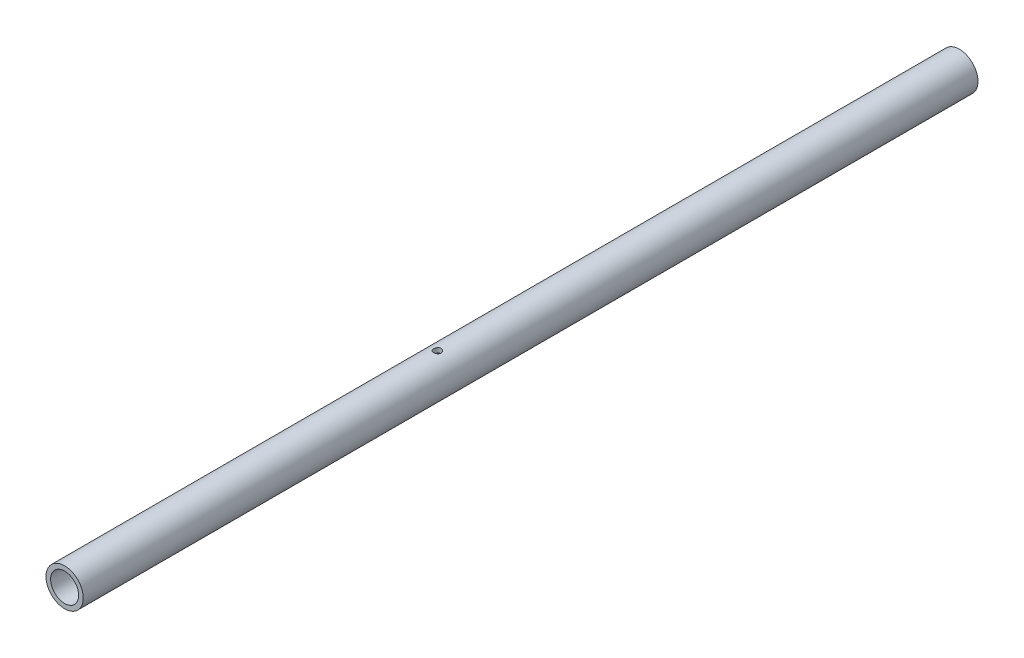
ISO-10303-21;
HEADER;
FILE_DESCRIPTION(('STEP AP214'),'2;1');
FILE_NAME('part.step','',(''),(''),'','','');
FILE_SCHEMA(('AUTOMOTIVE_DESIGN { 1 0 10303 214 1 1 1 1 }'));
ENDSEC;
DATA;
#1=APPLICATION_CONTEXT('core data for automotive mechanical design processes');
#2=APPLICATION_PROTOCOL_DEFINITION('international standard','automotive_design',2000,#1);
#3=PRODUCT_CONTEXT('',#1,'mechanical');
#4=PRODUCT('Part','Part','',(#3));
#5=PRODUCT_RELATED_PRODUCT_CATEGORY('part','',(#4));
#6=PRODUCT_DEFINITION_FORMATION('','',#4);
#7=PRODUCT_DEFINITION_CONTEXT('part definition',#1,'design');
#8=PRODUCT_DEFINITION('design','',#6,#7);
#9=PRODUCT_DEFINITION_SHAPE('','',#8);
#10=(LENGTH_UNIT() NAMED_UNIT(*) SI_UNIT(.MILLI.,.METRE.));
#11=(NAMED_UNIT(*) PLANE_ANGLE_UNIT() SI_UNIT($,.RADIAN.));
#12=(NAMED_UNIT(*) SI_UNIT($,.STERADIAN.) SOLID_ANGLE_UNIT());
#13=UNCERTAINTY_MEASURE_WITH_UNIT(LENGTH_MEASURE(1.E-05),#10,'distance_accuracy_value','');
#14=(GEOMETRIC_REPRESENTATION_CONTEXT(3) GLOBAL_UNCERTAINTY_ASSIGNED_CONTEXT((#13)) GLOBAL_UNIT_ASSIGNED_CONTEXT((#10,
#11,#12)) REPRESENTATION_CONTEXT('',''));
#15=CARTESIAN_POINT('',(0.,0.,0.));
#16=DIRECTION('',(0.,0.,1.));
#17=DIRECTION('',(1.,0.,0.));
#18=AXIS2_PLACEMENT_3D('',#15,#16,#17);
#19=CARTESIAN_POINT('',(-13.8622619933244,2.40966377504037,609.6));
#20=DIRECTION('',(0.,0.,1.));
#21=DIRECTION('',(1.,0.,0.));
#22=AXIS2_PLACEMENT_3D('',#19,#20,#21);
#23=PLANE('',#22);
#24=CARTESIAN_POINT('',(-13.8622619933244,2.40966377504037,609.6));
#25=DIRECTION('',(0.,0.,1.));
#26=DIRECTION('',(1.,0.,0.));
#27=AXIS2_PLACEMENT_3D('',#24,#25,#26);
#28=CIRCLE('',#27,12.7);
#29=CARTESIAN_POINT('',(-1.16226199332441,2.40966377504037,609.6));
#30=VERTEX_POINT('',#29);
#31=EDGE_CURVE('E41',#30,#30,#28,.T.);
#32=ORIENTED_EDGE('',*,*,#31,.T.);
#33=EDGE_LOOP('',(#32));
#34=FACE_BOUND('',#33,.T.);
#35=CARTESIAN_POINT('',(-13.8622619933244,2.40966377504037,609.6));
#36=DIRECTION('',(0.,0.,1.));
#37=DIRECTION('',(1.,0.,0.));
#38=AXIS2_PLACEMENT_3D('',#35,#36,#37);
#39=CIRCLE('',#38,9.55675);
#40=CARTESIAN_POINT('',(-4.30551199332441,2.40966377504037,609.6));
#41=VERTEX_POINT('',#40);
#42=EDGE_CURVE('E50',#41,#41,#39,.T.);
#43=ORIENTED_EDGE('',*,*,#42,.F.);
#44=EDGE_LOOP('',(#43));
#45=FACE_BOUND('',#44,.T.);
#46=ADVANCED_FACE('F30',(#34,#45),#23,.T.);
#47=CARTESIAN_POINT('',(-13.8622619933244,2.40966377504037,0.));
#48=DIRECTION('',(0.,0.,1.));
#49=DIRECTION('',(1.,0.,0.));
#50=AXIS2_PLACEMENT_3D('',#47,#48,#49);
#51=PLANE('',#50);
#52=CARTESIAN_POINT('',(-13.8622619933244,2.40966377504037,0.));
#53=DIRECTION('',(0.,0.,1.));
#54=DIRECTION('',(1.,0.,0.));
#55=AXIS2_PLACEMENT_3D('',#52,#53,#54);
#56=CIRCLE('',#55,12.7);
#57=CARTESIAN_POINT('',(-1.16226199332441,2.40966377504037,0.));
#58=VERTEX_POINT('',#57);
#59=EDGE_CURVE('E45',#58,#58,#56,.T.);
#60=ORIENTED_EDGE('',*,*,#59,.F.);
#61=EDGE_LOOP('',(#60));
#62=FACE_BOUND('',#61,.T.);
#63=CARTESIAN_POINT('',(-13.8622619933244,2.40966377504037,0.));
#64=DIRECTION('',(0.,0.,1.));
#65=DIRECTION('',(1.,0.,0.));
#66=AXIS2_PLACEMENT_3D('',#63,#64,#65);
#67=CIRCLE('',#66,9.55675);
#68=CARTESIAN_POINT('',(-4.30551199332441,2.40966377504037,0.));
#69=VERTEX_POINT('',#68);
#70=EDGE_CURVE('E52',#69,#69,#67,.T.);
#71=ORIENTED_EDGE('',*,*,#70,.T.);
#72=EDGE_LOOP('',(#71));
#73=FACE_BOUND('',#72,.T.);
#74=ADVANCED_FACE('F76',(#62,#73),#51,.F.);
#75=CARTESIAN_POINT('',(-13.8622619933244,2.40966377504037,609.6));
#76=DIRECTION('',(0.,0.,-1.));
#77=DIRECTION('',(-1.,0.,0.));
#78=AXIS2_PLACEMENT_3D('',#75,#76,#77);
#79=CYLINDRICAL_SURFACE('',#78,12.7);
#80=CARTESIAN_POINT('',(-13.8622619933244,15.1096637750404,353.0473));
#81=CARTESIAN_POINT('',(-13.7204057827676,15.1096611586529,353.047305200735));
#82=CARTESIAN_POINT('',(-13.5784839787694,15.107262639614,353.059164598029));
#83=CARTESIAN_POINT('',(-13.2986529241121,15.0979258413834,353.106250579905));
#84=CARTESIAN_POINT('',(-13.1607469347843,15.0909839742367,353.14149563282));
#85=CARTESIAN_POINT('',(-12.893033765658,15.073335524433,353.234219336538));
#86=CARTESIAN_POINT('',(-12.7632189314398,15.0626325655109,353.291676591655));
#87=CARTESIAN_POINT('',(-12.5150806503723,15.0386250168935,353.427129893154));
#88=CARTESIAN_POINT('',(-12.3967565397867,15.0253205776009,353.505124752259));
#89=CARTESIAN_POINT('',(-12.1733320243086,14.9973706267965,353.680569668399));
#90=CARTESIAN_POINT('',(-12.068411345603,14.9827106849205,353.778246325501));
#91=CARTESIAN_POINT('',(-11.8763283437059,14.9538068090996,353.989795075402));
#92=CARTESIAN_POINT('',(-11.7891674170271,14.9395629079447,354.103668440611));
#93=CARTESIAN_POINT('',(-11.6343116771957,14.9129628748564,354.345672792484));
#94=CARTESIAN_POINT('',(-11.5668032298707,14.900625305829,354.47392525346));
#95=CARTESIAN_POINT('',(-11.4543627713142,14.8794398873535,354.740241716888));
#96=CARTESIAN_POINT('',(-11.4094285060837,14.8705916895158,354.878304738199));
#97=CARTESIAN_POINT('',(-11.3439959314843,14.8575328843612,355.158388719178));
#98=CARTESIAN_POINT('',(-11.323182143375,14.8532624598362,355.30033313141));
#99=CARTESIAN_POINT('',(-11.3056013920064,14.8496626863383,355.585758579141));
#100=CARTESIAN_POINT('',(-11.3088319447216,14.8503328269545,355.729239454379));
#101=CARTESIAN_POINT('',(-11.3389931645088,14.8564841283913,356.011354922535));
#102=CARTESIAN_POINT('',(-11.3655619321963,14.8618918218771,356.150030047463));
#103=CARTESIAN_POINT('',(-11.4410740395656,14.8767932140671,356.42091365427));
#104=CARTESIAN_POINT('',(-11.4900184574477,14.8862871096691,356.55312182419));
#105=CARTESIAN_POINT('',(-11.6092373931908,14.9083661556152,356.80836025394));
#106=CARTESIAN_POINT('',(-11.6796551338735,14.9209719507553,356.931321756189));
#107=CARTESIAN_POINT('',(-11.8397207771334,14.9478412161563,357.163818797057));
#108=CARTESIAN_POINT('',(-11.9293709109918,14.9621048786698,357.273352775537));
#109=CARTESIAN_POINT('',(-12.1272930331707,14.9910008418561,357.477973503767));
#110=CARTESIAN_POINT('',(-12.2358738401003,15.0056351309922,357.57276151599));
#111=CARTESIAN_POINT('',(-12.467549438495,15.0333861229597,357.742825887018));
#112=CARTESIAN_POINT('',(-12.5906444196655,15.0465028059508,357.818101990754));
#113=CARTESIAN_POINT('',(-12.8481876705793,15.0697734243641,357.947061944509));
#114=CARTESIAN_POINT('',(-12.9826536224976,15.0799226318507,358.000711388755));
#115=CARTESIAN_POINT('',(-13.2589395087703,15.0960789131938,358.08457521897));
#116=CARTESIAN_POINT('',(-13.4007585409205,15.1020864939303,358.114792472783));
#117=CARTESIAN_POINT('',(-13.685157941826,15.1092119591407,358.150510629405));
#118=CARTESIAN_POINT('',(-13.8276850065463,15.1104107066985,358.156420320225));
#119=CARTESIAN_POINT('',(-14.1116900394117,15.1080081464696,358.144456877135));
#120=CARTESIAN_POINT('',(-14.2531680666904,15.1044071113449,358.126585094183));
#121=CARTESIAN_POINT('',(-14.5297383768159,15.0928602268743,358.067905603445));
#122=CARTESIAN_POINT('',(-14.6648770200629,15.0849541741131,358.027307884593));
#123=CARTESIAN_POINT('',(-14.9264287240498,15.0656806038995,357.924558594025));
#124=CARTESIAN_POINT('',(-15.0528411253332,15.0543128251894,357.862405395459));
#125=CARTESIAN_POINT('',(-15.2950742453157,15.0291755126966,357.717426772793));
#126=CARTESIAN_POINT('',(-15.4107448872437,15.0153780528199,357.63435554216));
#127=CARTESIAN_POINT('',(-15.6266511903425,14.9869770856882,357.450227790706));
#128=CARTESIAN_POINT('',(-15.7268851766882,14.9723734912034,357.349169320891));
#129=CARTESIAN_POINT('',(-15.9106525828315,14.9437332522198,357.130074042762));
#130=CARTESIAN_POINT('',(-15.9939052374518,14.9297087921186,357.011799871748));
#131=CARTESIAN_POINT('',(-16.1393633001936,14.9040740088834,356.762706031197));
#132=CARTESIAN_POINT('',(-16.2015695547934,14.8924635886649,356.631886866489));
#133=CARTESIAN_POINT('',(-16.3027869348437,14.8730701083321,356.362078298441));
#134=CARTESIAN_POINT('',(-16.3419189420769,14.8652671394848,356.22313574275));
#135=CARTESIAN_POINT('',(-16.3962430460083,14.8543301692211,355.940473696876));
#136=CARTESIAN_POINT('',(-16.4114382999843,14.851195552048,355.796754839245));
#137=CARTESIAN_POINT('',(-16.4173397968084,14.8499846242466,355.511439364005));
#138=CARTESIAN_POINT('',(-16.4084897704955,14.8518166578258,355.369852127459));
#139=CARTESIAN_POINT('',(-16.3675319034266,14.860127692542,355.090228771901));
#140=CARTESIAN_POINT('',(-16.3354242536665,14.8666066555176,354.952192623737));
#141=CARTESIAN_POINT('',(-16.2490613624089,14.8834403598629,354.683875720419));
#142=CARTESIAN_POINT('',(-16.1948610573533,14.8937854822247,354.553576640171));
#143=CARTESIAN_POINT('',(-16.0659025566248,14.9171912744137,354.303852292771));
#144=CARTESIAN_POINT('',(-15.9911426151044,14.9302521748316,354.184427950208));
#145=CARTESIAN_POINT('',(-15.8216736916891,14.9578979909401,353.957634697279));
#146=CARTESIAN_POINT('',(-15.7266444730141,14.972505208135,353.850507755241));
#147=CARTESIAN_POINT('',(-15.5199950483009,15.001438263291,353.653574047455));
#148=CARTESIAN_POINT('',(-15.4083710340241,15.0157640358085,353.56377126822));
#149=CARTESIAN_POINT('',(-15.1702799474514,15.0426990062475,353.403136410106));
#150=CARTESIAN_POINT('',(-15.0436682129297,15.0552884202236,353.332515289881));
#151=CARTESIAN_POINT('',(-14.78015612986,15.0771372836463,353.213663997138));
#152=CARTESIAN_POINT('',(-14.643265151143,15.0863997222294,353.165413714043));
#153=CARTESIAN_POINT('',(-14.3987729443139,15.0987590830451,353.10198037411));
#154=CARTESIAN_POINT('',(-14.2925601813473,15.1028243403546,353.081511922206));
#155=CARTESIAN_POINT('',(-14.078331590228,15.1082776393898,353.054169974963));
#156=CARTESIAN_POINT('',(-13.970315820691,15.1096657679787,353.047296038529));
#157=CARTESIAN_POINT('',(-13.8622619933244,15.1096637750404,353.0473));
#158=B_SPLINE_CURVE_WITH_KNOTS('',3,(#80,#81,#82,#83,#84,#85,#86,#87,#88,#89,#90,#91,#92,#93,
#94,#95,#96,#97,#98,#99,#100,#101,#102,#103,#104,#105,#106,#107,#108,#109,#110,#111,#112,#113,
#114,#115,#116,#117,#118,#119,#120,#121,#122,#123,#124,#125,#126,#127,#128,#129,#130,#131,#132,
#133,#134,#135,#136,#137,#138,#139,#140,#141,#142,#143,#144,#145,#146,#147,#148,#149,#150,#151,
#152,#153,#154,#155,#156,#157),.UNSPECIFIED.,.T.,.F.,(4,2,2,2,2,2,2,2,2,2,2,2,2,2,2,2,2,2,2,2,2,
2,2,2,2,2,2,2,2,2,2,2,2,2,2,2,2,2,4),(0.,0.425173326858357,0.850682825726704,1.27578347391369,
1.70085955247511,2.13114227989734,2.56145882893969,2.9957322536281,3.42996230812812,
3.85844645262256,4.28688633094916,4.70879751785867,5.13072903726015,5.55553870266187,
5.9803976798127,6.41297793207709,6.84556383894967,7.27883525459767,7.7120536341753,
8.13795588808111,8.56383394874414,8.98584032623795,9.40787856061102,9.83512862114261,
10.2624250042595,10.6962975397843,11.1301526230407,11.5617141464937,11.9932187418525,
12.416814710791,12.8404072011225,13.2629527342799,13.6855341595118,14.1153652704349,
14.5452951733749,14.9797777811894,15.4138690438583,15.7377399254776,16.061600298463),.UNSPECIFIED.);
#159=CARTESIAN_POINT('',(-13.8622619933244,15.1096637750404,353.0473));
#160=VERTEX_POINT('',#159);
#161=EDGE_CURVE('E10',#160,#160,#158,.T.);
#162=ORIENTED_EDGE('',*,*,#161,.T.);
#163=EDGE_LOOP('',(#162));
#164=FACE_BOUND('',#163,.T.);
#165=ORIENTED_EDGE('',*,*,#31,.F.);
#166=EDGE_LOOP('',(#165));
#167=FACE_BOUND('',#166,.T.);
#168=ORIENTED_EDGE('',*,*,#59,.T.);
#169=EDGE_LOOP('',(#168));
#170=FACE_BOUND('',#169,.T.);
#171=ADVANCED_FACE('F32',(#164,#167,#170),#79,.T.);
#172=CARTESIAN_POINT('',(-13.8622619933244,2.40966377504037,609.6));
#173=DIRECTION('',(0.,0.,-1.));
#174=DIRECTION('',(-1.,0.,0.));
#175=AXIS2_PLACEMENT_3D('',#172,#173,#174);
#176=CYLINDRICAL_SURFACE('',#175,9.55675);
#177=CARTESIAN_POINT('',(-13.8622619933244,11.9664137750404,353.0473));
#178=CARTESIAN_POINT('',(-13.7215472167886,11.9664116624697,353.047303322042));
#179=CARTESIAN_POINT('',(-13.5807968721788,11.963275349198,353.058974121854));
#180=CARTESIAN_POINT('',(-13.3033513503346,11.9510685888795,353.105265980016));
#181=CARTESIAN_POINT('',(-13.1666581479108,11.9419952999726,353.139898029363));
#182=CARTESIAN_POINT('',(-12.901371790922,11.9189159478634,353.230905695941));
#183=CARTESIAN_POINT('',(-12.7727684221081,11.9049162583421,353.287253227027));
#184=CARTESIAN_POINT('',(-12.5268372824002,11.8734633138969,353.419988100835));
#185=CARTESIAN_POINT('',(-12.4095102735691,11.8560098258066,353.496376796651));
#186=CARTESIAN_POINT('',(-12.1867336998944,11.8190795095273,353.66890118329));
#187=CARTESIAN_POINT('',(-12.0815837465425,11.7995680078838,353.76541634058));
#188=CARTESIAN_POINT('',(-11.8887534693825,11.7609431747631,353.974642785438));
#189=CARTESIAN_POINT('',(-11.8010754024915,11.7418298950112,354.087356162165));
#190=CARTESIAN_POINT('',(-11.6442154292095,11.7058107424674,354.328172867877));
#191=CARTESIAN_POINT('',(-11.5753784680237,11.6889486077642,354.456508025619));
#192=CARTESIAN_POINT('',(-11.460376635329,11.6598508353373,354.723453479016));
#193=CARTESIAN_POINT('',(-11.4142075678479,11.6476143414743,354.862061867558));
#194=CARTESIAN_POINT('',(-11.3468931372153,11.6295113347289,355.142300461558));
#195=CARTESIAN_POINT('',(-11.3252044453248,11.6235067616524,355.283791021313));
#196=CARTESIAN_POINT('',(-11.3057724909374,11.618134994094,355.568520025096));
#197=CARTESIAN_POINT('',(-11.3080247381191,11.61876655495,355.711758136323));
#198=CARTESIAN_POINT('',(-11.3359794378045,11.6264721455117,355.991673168792));
#199=CARTESIAN_POINT('',(-11.3610241512212,11.6333654647107,356.12842154374));
#200=CARTESIAN_POINT('',(-11.432799285586,11.6525284791852,356.395701278564));
#201=CARTESIAN_POINT('',(-11.4795314448489,11.6647986054237,356.526232139164));
#202=CARTESIAN_POINT('',(-11.5938902328681,11.6934914177364,356.779084698942));
#203=CARTESIAN_POINT('',(-11.6617472307168,11.7099595056613,356.90129683838));
#204=CARTESIAN_POINT('',(-11.8162687777403,11.7451683288201,357.132830744193));
#205=CARTESIAN_POINT('',(-11.9029370402198,11.7639095124357,357.242149958947));
#206=CARTESIAN_POINT('',(-12.0959827709914,11.8023048307769,357.44855242363));
#207=CARTESIAN_POINT('',(-12.2029124908073,11.8219687695577,357.545118064157));
#208=CARTESIAN_POINT('',(-12.4316884461905,11.8594439727414,357.719052786983));
#209=CARTESIAN_POINT('',(-12.5535352732175,11.8772551636315,357.796421107743));
#210=CARTESIAN_POINT('',(-12.8094899849038,11.9091281972194,357.929993948079));
#211=CARTESIAN_POINT('',(-12.9436491091248,11.9231733201367,357.986104532366));
#212=CARTESIAN_POINT('',(-13.2199570396853,11.9458108612319,358.0748259));
#213=CARTESIAN_POINT('',(-13.3621040867788,11.9544044749568,358.10744183607));
#214=CARTESIAN_POINT('',(-13.6459356648802,11.9649898249902,358.147434727971));
#215=CARTESIAN_POINT('',(-13.7875143282486,11.9671655804876,358.15551538847));
#216=CARTESIAN_POINT('',(-14.0700039983647,11.965199267644,358.148152083691));
#217=CARTESIAN_POINT('',(-14.2109150728467,11.9610578546441,358.132710558598));
#218=CARTESIAN_POINT('',(-14.4855561764099,11.9470414168291,358.07931830772));
#219=CARTESIAN_POINT('',(-14.6193681344991,11.9372664932534,358.041760319726));
#220=CARTESIAN_POINT('',(-14.8787790628697,11.9130921104145,357.945657550869));
#221=CARTESIAN_POINT('',(-15.0043771398954,11.8986921491839,357.887110491928));
#222=CARTESIAN_POINT('',(-15.2465275373547,11.8664341192266,357.749387807705));
#223=CARTESIAN_POINT('',(-15.3628537900821,11.8485136955917,357.669829670342));
#224=CARTESIAN_POINT('',(-15.5807517512218,11.8112861470162,357.492823873363));
#225=CARTESIAN_POINT('',(-15.6823205280492,11.791978747687,357.395372667953));
#226=CARTESIAN_POINT('',(-15.8707873630654,11.7534758907255,357.182062741355));
#227=CARTESIAN_POINT('',(-15.9571888671438,11.7342990657601,357.065761117897));
#228=CARTESIAN_POINT('',(-16.1092600346183,11.6988290175039,356.819904012356));
#229=CARTESIAN_POINT('',(-16.1749305606305,11.6825356742437,356.690349082041));
#230=CARTESIAN_POINT('',(-16.2831815402857,11.6548648230478,356.422307058399));
#231=CARTESIAN_POINT('',(-16.3258954553151,11.6434589813174,356.283876947803));
#232=CARTESIAN_POINT('',(-16.387334897217,11.6268493295501,356.001442342041));
#233=CARTESIAN_POINT('',(-16.4060665792467,11.6216439281638,355.857439286976));
#234=CARTESIAN_POINT('',(-16.4186549370163,11.6181577693364,355.573031152566));
#235=CARTESIAN_POINT('',(-16.4133098449397,11.6196547921251,355.432663599961));
#236=CARTESIAN_POINT('',(-16.3797486787555,11.6288843498032,355.154909419248));
#237=CARTESIAN_POINT('',(-16.3515331969069,11.6366167232199,355.017522714041));
#238=CARTESIAN_POINT('',(-16.2734956673992,11.6573132471667,354.750638546436));
#239=CARTESIAN_POINT('',(-16.2238432935922,11.6702362587482,354.621088056247));
#240=CARTESIAN_POINT('',(-16.104473216003,11.6998588406178,354.372058172428));
#241=CARTESIAN_POINT('',(-16.0347523551707,11.7165590050156,354.252580367196));
#242=CARTESIAN_POINT('',(-15.874807417461,11.7524699449392,354.023278540246));
#243=CARTESIAN_POINT('',(-15.7840388842297,11.7717402767941,353.913843572288));
#244=CARTESIAN_POINT('',(-15.5856099454971,11.8102882280922,353.711499235694));
#245=CARTESIAN_POINT('',(-15.4779454354682,11.8295658481678,353.61859389432));
#246=CARTESIAN_POINT('',(-15.2459896213746,11.866451584861,353.449983640914));
#247=CARTESIAN_POINT('',(-15.1213907903182,11.8840149337919,353.374691163617));
#248=CARTESIAN_POINT('',(-14.8608392440709,11.9150029649856,353.246239870629));
#249=CARTESIAN_POINT('',(-14.7248938568682,11.928430292543,353.193066900201));
#250=CARTESIAN_POINT('',(-14.4682616984736,11.9479040771607,353.117272305503));
#251=CARTESIAN_POINT('',(-14.3486774339234,11.9547945471884,353.091093762289));
#252=CARTESIAN_POINT('',(-14.1068248871175,11.9640500890851,353.056107029816));
#253=CARTESIAN_POINT('',(-13.9845568730501,11.9664156110706,353.047297112821));
#254=CARTESIAN_POINT('',(-13.8622619933244,11.9664137750404,353.0473));
#255=B_SPLINE_CURVE_WITH_KNOTS('',3,(#177,#178,#179,#180,#181,#182,#183,#184,#185,#186,#187,
#188,#189,#190,#191,#192,#193,#194,#195,#196,#197,#198,#199,#200,#201,#202,#203,#204,#205,#206,
#207,#208,#209,#210,#211,#212,#213,#214,#215,#216,#217,#218,#219,#220,#221,#222,#223,#224,#225,
#226,#227,#228,#229,#230,#231,#232,#233,#234,#235,#236,#237,#238,#239,#240,#241,#242,#243,#244,
#245,#246,#247,#248,#249,#250,#251,#252,#253,#254),.UNSPECIFIED.,.T.,.F.,(4,2,2,2,2,2,2,2,2,2,2,
2,2,2,2,2,2,2,2,2,2,2,2,2,2,2,2,2,2,2,2,2,2,2,2,2,2,2,4),(0.,0.421695833506124,
0.843593668528203,1.26494765514494,1.6863300971134,2.11652252801831,2.54677049272107,
2.98443617093046,3.42202080385076,3.84968980164627,4.27727858799641,4.69290635822628,
5.1085674480444,5.52893030256694,5.94937621143172,6.38358369967526,6.81780840972751,
7.25393012471075,7.68995616262493,8.11335230603884,8.53670452946827,8.95275651290795,
9.36885366682627,9.79312184222631,10.2174741839637,10.6538362654556,11.0901801875225,
11.5239591448036,11.957626748267,12.3770244894371,12.7964113700937,13.2125379522695,
13.6287300327131,14.0572070441388,14.4857883067727,14.9235775957699,15.3610863016337,
15.7276176162956,16.0941124685711),.UNSPECIFIED.);
#256=CARTESIAN_POINT('',(-13.8622619933244,11.9664137750404,353.0473));
#257=VERTEX_POINT('',#256);
#258=EDGE_CURVE('E55',#257,#257,#255,.T.);
#259=ORIENTED_EDGE('',*,*,#258,.F.);
#260=EDGE_LOOP('',(#259));
#261=FACE_BOUND('',#260,.T.);
#262=ORIENTED_EDGE('',*,*,#42,.T.);
#263=EDGE_LOOP('',(#262));
#264=FACE_BOUND('',#263,.T.);
#265=ORIENTED_EDGE('',*,*,#70,.F.);
#266=EDGE_LOOP('',(#265));
#267=FACE_BOUND('',#266,.T.);
#268=ADVANCED_FACE('F62',(#261,#264,#267),#176,.F.);
#269=CARTESIAN_POINT('',(-13.8622619933244,0.,355.6));
#270=DIRECTION('',(0.,-1.,0.));
#271=DIRECTION('',(0.,0.,-1.));
#272=AXIS2_PLACEMENT_3D('',#269,#270,#271);
#273=CYLINDRICAL_SURFACE('',#272,2.55269999999999);
#274=ORIENTED_EDGE('',*,*,#258,.T.);
#275=EDGE_LOOP('',(#274));
#276=FACE_BOUND('',#275,.T.);
#277=ORIENTED_EDGE('',*,*,#161,.F.);
#278=EDGE_LOOP('',(#277));
#279=FACE_BOUND('',#278,.T.);
#280=ADVANCED_FACE('F65',(#276,#279),#273,.F.);
#281=CLOSED_SHELL('',(#46,#74,#171,#268,#280));
#282=MANIFOLD_SOLID_BREP('B2',#281);
#283=ADVANCED_BREP_SHAPE_REPRESENTATION('',(#18,#282),#14);
#284=SHAPE_DEFINITION_REPRESENTATION(#9,#283);
ENDSEC;
END-ISO-10303-21;
